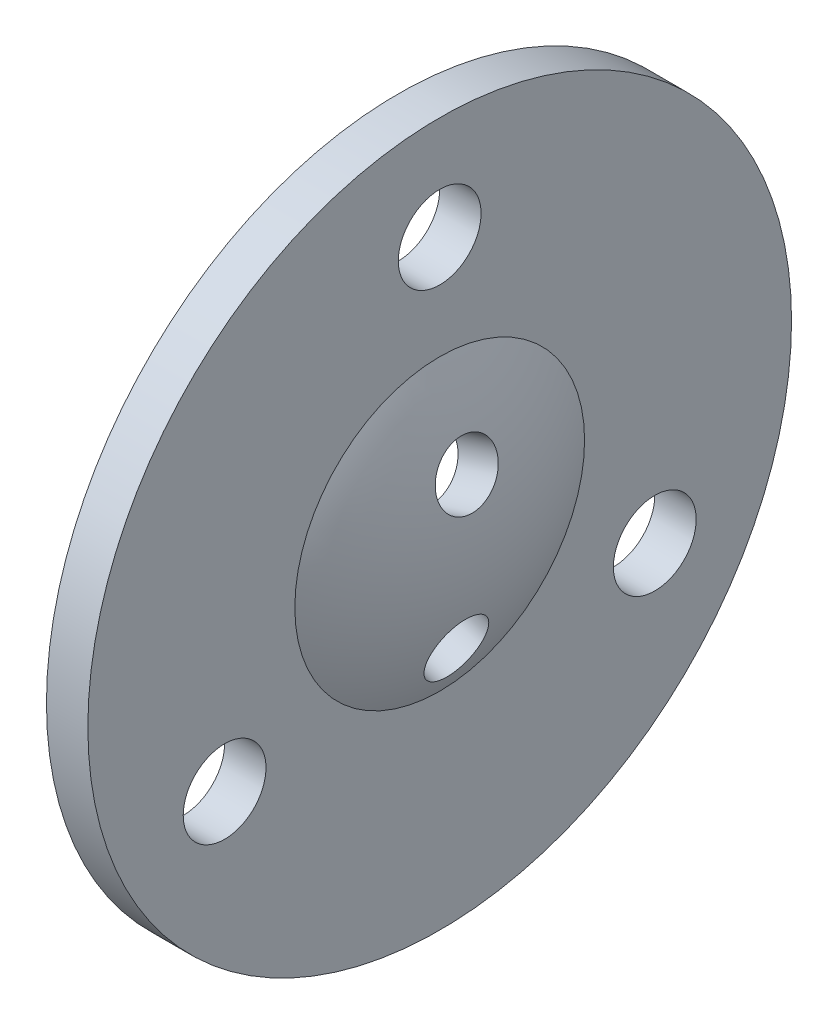
ISO-10303-21;
HEADER;
FILE_DESCRIPTION(('STEP AP214'),'2;1');
FILE_NAME('part.step','',(''),(''),'','','');
FILE_SCHEMA(('AUTOMOTIVE_DESIGN { 1 0 10303 214 1 1 1 1 }'));
ENDSEC;
DATA;
#1=APPLICATION_CONTEXT('core data for automotive mechanical design processes');
#2=APPLICATION_PROTOCOL_DEFINITION('international standard','automotive_design',2000,#1);
#3=PRODUCT_CONTEXT('',#1,'mechanical');
#4=PRODUCT('Part','Part','',(#3));
#5=PRODUCT_RELATED_PRODUCT_CATEGORY('part','',(#4));
#6=PRODUCT_DEFINITION_FORMATION('','',#4);
#7=PRODUCT_DEFINITION_CONTEXT('part definition',#1,'design');
#8=PRODUCT_DEFINITION('design','',#6,#7);
#9=PRODUCT_DEFINITION_SHAPE('','',#8);
#10=(LENGTH_UNIT() NAMED_UNIT(*) SI_UNIT(.MILLI.,.METRE.));
#11=(NAMED_UNIT(*) PLANE_ANGLE_UNIT() SI_UNIT($,.RADIAN.));
#12=(NAMED_UNIT(*) SI_UNIT($,.STERADIAN.) SOLID_ANGLE_UNIT());
#13=UNCERTAINTY_MEASURE_WITH_UNIT(LENGTH_MEASURE(1.E-05),#10,'distance_accuracy_value','');
#14=(GEOMETRIC_REPRESENTATION_CONTEXT(3) GLOBAL_UNCERTAINTY_ASSIGNED_CONTEXT((#13)) GLOBAL_UNIT_ASSIGNED_CONTEXT((#10,
#11,#12)) REPRESENTATION_CONTEXT('',''));
#15=CARTESIAN_POINT('',(0.,0.,0.));
#16=DIRECTION('',(0.,0.,1.));
#17=DIRECTION('',(1.,0.,0.));
#18=AXIS2_PLACEMENT_3D('',#15,#16,#17);
#19=CARTESIAN_POINT('',(0.,0.,0.));
#20=DIRECTION('',(-1.,0.,0.));
#21=DIRECTION('',(0.,1.,0.));
#22=AXIS2_PLACEMENT_3D('',#19,#20,#21);
#23=SPHERICAL_SURFACE('',#22,16.);
#24=CARTESIAN_POINT('',(15.1922649930537,-4.79010275263843,0.));
#25=DIRECTION('',(-0.953716950748227,0.300705799504274,0.));
#26=DIRECTION('',(-0.300705799504274,-0.953716950748227,0.));
#27=AXIS2_PLACEMENT_3D('',#24,#25,#26);
#28=CIRCLE('',#27,1.5);
#29=CARTESIAN_POINT('',(14.7412062937973,-6.22067817876077,0.));
#30=VERTEX_POINT('',#29);
#31=EDGE_CURVE('E60',#30,#30,#28,.T.);
#32=ORIENTED_EDGE('',*,*,#31,.T.);
#33=EDGE_LOOP('',(#32));
#34=FACE_BOUND('',#33,.T.);
#35=CARTESIAN_POINT('',(15.9214315608037,1.41312496248095,-0.714909011733329));
#36=CARTESIAN_POINT('',(15.9282394674415,1.37355134846859,-0.641508794516006));
#37=CARTESIAN_POINT('',(15.9340028574223,1.34003315946315,-0.564680552146841));
#38=CARTESIAN_POINT('',(15.9432660539467,1.28614947605179,-0.406345507594198));
#39=CARTESIAN_POINT('',(15.946763334226,1.26579866070172,-0.324833593828127));
#40=CARTESIAN_POINT('',(15.9513852532108,1.23890165254398,-0.159514459844571));
#41=CARTESIAN_POINT('',(15.952510608447,1.23235129078241,-0.0757079405522018));
#42=CARTESIAN_POINT('',(15.9523569151515,1.23324582428864,0.0918067045976922));
#43=CARTESIAN_POINT('',(15.9510784317157,1.24068743031695,0.175514848952478));
#44=CARTESIAN_POINT('',(15.9461606645701,1.26930557187547,0.340307980049379));
#45=CARTESIAN_POINT('',(15.9425259943062,1.29045526676845,0.421397768525313));
#46=CARTESIAN_POINT('',(15.9330053210524,1.34583472699573,0.578841427233263));
#47=CARTESIAN_POINT('',(15.9271192231664,1.38006504366901,0.655195097683552));
#48=CARTESIAN_POINT('',(15.9132446544674,1.46071235838254,0.801243005191184));
#49=CARTESIAN_POINT('',(15.9052502608605,1.50716368778359,0.870917715232028));
#50=CARTESIAN_POINT('',(15.8873942773776,1.6108530670673,1.0014403677339));
#51=CARTESIAN_POINT('',(15.8775326249463,1.66809147832955,1.06228801435731));
#52=CARTESIAN_POINT('',(15.8561382312471,1.79218111850615,1.17392484133709));
#53=CARTESIAN_POINT('',(15.8445935066339,1.85910125203666,1.22463512524324));
#54=CARTESIAN_POINT('',(15.8202126525132,2.0003179301913,1.31405242726557));
#55=CARTESIAN_POINT('',(15.8073764637763,2.07461481312704,1.35275889452814));
#56=CARTESIAN_POINT('',(15.7806510085735,2.22917657850958,1.41742171420749));
#57=CARTESIAN_POINT('',(15.7667534761029,2.30948818610949,1.44326298255995));
#58=CARTESIAN_POINT('',(15.7383945297169,2.47322969518423,1.48099056466402));
#59=CARTESIAN_POINT('',(15.7239330928618,2.55665972351124,1.49287631008924));
#60=CARTESIAN_POINT('',(15.6947590649336,2.72482443898191,1.50240471353614));
#61=CARTESIAN_POINT('',(15.6800454708639,2.80956401447904,1.49995825760005));
#62=CARTESIAN_POINT('',(15.6508727861239,2.97743634840585,1.48067724233807));
#63=CARTESIAN_POINT('',(15.6364136990489,3.06056908413914,1.46384247993102));
#64=CARTESIAN_POINT('',(15.6081497886699,3.22294394058286,1.41621247382764));
#65=CARTESIAN_POINT('',(15.5943456144052,3.30218220443282,1.38540368799683));
#66=CARTESIAN_POINT('',(15.5678080541037,3.45440162397824,1.31065894489047));
#67=CARTESIAN_POINT('',(15.5550746490555,3.52738289076639,1.26672322074524));
#68=CARTESIAN_POINT('',(15.5311113373314,3.66464047679794,1.16717095470493));
#69=CARTESIAN_POINT('',(15.519874718343,3.7289556749937,1.11160964695809));
#70=CARTESIAN_POINT('',(15.499172090143,3.84738860205327,0.990232997111271));
#71=CARTESIAN_POINT('',(15.4897060054105,3.90150676586572,0.924418092591439));
#72=CARTESIAN_POINT('',(15.472902191411,3.99753542140749,0.784975557874616));
#73=CARTESIAN_POINT('',(15.4655477143373,4.03954198581587,0.711416110160352));
#74=CARTESIAN_POINT('',(15.4530896003373,4.11067880397958,0.55813802174442));
#75=CARTESIAN_POINT('',(15.4479858555917,4.13980967453282,0.47841967629388));
#76=CARTESIAN_POINT('',(15.4402188398955,4.18413518774624,0.315779970695861));
#77=CARTESIAN_POINT('',(15.4375361803432,4.19944054914605,0.232889700723616));
#78=CARTESIAN_POINT('',(15.4346235466551,4.21605776900795,0.0656766410495282));
#79=CARTESIAN_POINT('',(15.4343934934669,4.21737007849394,-0.0186461023930988));
#80=CARTESIAN_POINT('',(15.4363884745262,4.20598855384075,-0.185927053628296));
#81=CARTESIAN_POINT('',(15.4386024353553,4.19335789296813,-0.268889701735019));
#82=CARTESIAN_POINT('',(15.4453999633499,4.15456809902756,-0.431486968879458));
#83=CARTESIAN_POINT('',(15.4499835233678,4.12840900676626,-0.511121597954902));
#84=CARTESIAN_POINT('',(15.4613865968583,4.06330524506965,-0.664894946527899));
#85=CARTESIAN_POINT('',(15.4682082027248,4.02434861091145,-0.739028443071157));
#86=CARTESIAN_POINT('',(15.4838816974956,3.93479663916341,-0.87965549999377));
#87=CARTESIAN_POINT('',(15.4927336360224,3.8842010171098,-0.946148873584427));
#88=CARTESIAN_POINT('',(15.5122651743086,3.77249673030015,-1.07004273962463));
#89=CARTESIAN_POINT('',(15.5229553398258,3.71132727794411,-1.12738674926237));
#90=CARTESIAN_POINT('',(15.5458140201554,3.58043926699733,-1.23094128570615));
#91=CARTESIAN_POINT('',(15.5579826020616,3.5107203204097,-1.2771513069423));
#92=CARTESIAN_POINT('',(15.5835574691787,3.36408010356739,-1.35754063366048));
#93=CARTESIAN_POINT('',(15.5969733606532,3.2871028552543,-1.3916147747377));
#94=CARTESIAN_POINT('',(15.6245704387393,3.12862824542189,-1.44627127556417));
#95=CARTESIAN_POINT('',(15.6387516604006,3.04713067688111,-1.46685301683473));
#96=CARTESIAN_POINT('',(15.6675868403491,2.88127896915819,-1.49408081170484));
#97=CARTESIAN_POINT('',(15.6822435293583,2.79690809742297,-1.50062212375251));
#98=CARTESIAN_POINT('',(15.7115129607802,2.62827512768309,-1.49928461249674));
#99=CARTESIAN_POINT('',(15.7261257037481,2.54401302831184,-1.49140597216232));
#100=CARTESIAN_POINT('',(15.7549401070526,2.37772015292574,-1.46139574430588));
#101=CARTESIAN_POINT('',(15.769140385628,2.29569692252324,-1.43922098518504));
#102=CARTESIAN_POINT('',(15.7966843409988,2.13647159849106,-1.38116755718928));
#103=CARTESIAN_POINT('',(15.810027809793,2.05927067565969,-1.34528557529624));
#104=CARTESIAN_POINT('',(15.8354447112687,1.91210963140862,-1.26090079470531));
#105=CARTESIAN_POINT('',(15.8475208279776,1.84213421292943,-1.21242545604378));
#106=CARTESIAN_POINT('',(15.8700788818365,1.71133753364874,-1.10419002773948));
#107=CARTESIAN_POINT('',(15.8805627766805,1.65050503227469,-1.04444400192802));
#108=CARTESIAN_POINT('',(15.8961138984722,1.56022263708914,-0.939248372495269));
#109=CARTESIAN_POINT('',(15.9017520805606,1.52747730882856,-0.896662289241859));
#110=CARTESIAN_POINT('',(15.9122155206048,1.46669003909626,-0.808162445182826));
#111=CARTESIAN_POINT('',(15.9170407815108,1.4386480805544,-0.762248696455313));
#112=CARTESIAN_POINT('',(15.9214315608037,1.41312496248095,-0.714909011733329));
#113=B_SPLINE_CURVE_WITH_KNOTS('',3,(#35,#36,#37,#38,#39,#40,#41,#42,#43,#44,#45,#46,#47,#48,
#49,#50,#51,#52,#53,#54,#55,#56,#57,#58,#59,#60,#61,#62,#63,#64,#65,#66,#67,#68,#69,#70,#71,#72,
#73,#74,#75,#76,#77,#78,#79,#80,#81,#82,#83,#84,#85,#86,#87,#88,#89,#90,#91,#92,#93,#94,#95,#96,
#97,#98,#99,#100,#101,#102,#103,#104,#105,#106,#107,#108,#109,#110,#111,#112),.UNSPECIFIED.,.T.,
.F.,(4,2,2,2,2,2,2,2,2,2,2,2,2,2,2,2,2,2,2,2,2,2,2,2,2,2,2,2,2,2,2,2,2,2,2,2,2,2,4),(0.,
0.250802516617027,0.50188414961433,0.752889922936274,1.00383669706018,1.25429359208518,
1.50476104485625,1.75593976825355,2.00712690792188,2.26019875870744,2.51328222121017,
2.76859066298819,3.02390950161727,3.28081752541618,3.53772917535703,3.79489033040511,
4.05204691862285,4.3080084020411,4.56395896509621,4.81781958004914,5.07166803273163,
5.32346509077693,5.57525403287745,5.82590682657553,6.07655886421841,6.32744591246443,
6.57833909319005,6.83072575178381,7.08312386854106,7.33765879459324,7.59220538746693,
7.8486443907601,8.10508014022386,8.362293928048,8.61956992348834,8.8762895652007,
9.13269095999372,9.29444736353342,9.45620317999071),.UNSPECIFIED.);
#114=CARTESIAN_POINT('',(15.9214315608037,1.41312496248095,-0.714909011733329));
#115=VERTEX_POINT('',#114);
#116=EDGE_CURVE('E59',#115,#115,#113,.T.);
#117=ORIENTED_EDGE('',*,*,#116,.T.);
#118=EDGE_LOOP('',(#117));
#119=FACE_BOUND('',#118,.T.);
#120=CARTESIAN_POINT('',(14.3874945699382,0.,0.));
#121=DIRECTION('',(-1.,0.,0.));
#122=DIRECTION('',(0.,0.,1.));
#123=AXIS2_PLACEMENT_3D('',#120,#121,#122);
#124=CIRCLE('',#123,7.);
#125=CARTESIAN_POINT('',(14.3874945699382,0.,7.));
#126=VERTEX_POINT('',#125);
#127=EDGE_CURVE('E10',#126,#126,#124,.T.);
#128=ORIENTED_EDGE('',*,*,#127,.F.);
#129=EDGE_LOOP('',(#128));
#130=FACE_BOUND('',#129,.T.);
#131=ADVANCED_FACE('F36',(#34,#119,#130),#23,.T.);
#132=CARTESIAN_POINT('',(14.3874945699382,7.,0.));
#133=DIRECTION('',(-1.,0.,0.));
#134=DIRECTION('',(0.,0.,1.));
#135=AXIS2_PLACEMENT_3D('',#132,#133,#134);
#136=PLANE('',#135);
#137=CARTESIAN_POINT('',(14.3874945699382,-5.99999999999991,-10.3923048454133));
#138=DIRECTION('',(-1.,0.,0.));
#139=DIRECTION('',(0.,0.,1.));
#140=AXIS2_PLACEMENT_3D('',#137,#138,#139);
#141=CIRCLE('',#140,2.);
#142=CARTESIAN_POINT('',(14.3874945699382,-5.99999999999991,-8.39230484541332));
#143=VERTEX_POINT('',#142);
#144=EDGE_CURVE('E97',#143,#143,#141,.T.);
#145=ORIENTED_EDGE('',*,*,#144,.T.);
#146=EDGE_LOOP('',(#145));
#147=FACE_BOUND('',#146,.T.);
#148=CARTESIAN_POINT('',(14.3874945699382,12.,0.));
#149=DIRECTION('',(-1.,0.,0.));
#150=DIRECTION('',(0.,0.,1.));
#151=AXIS2_PLACEMENT_3D('',#148,#149,#150);
#152=CIRCLE('',#151,2.);
#153=CARTESIAN_POINT('',(14.3874945699382,12.,2.));
#154=VERTEX_POINT('',#153);
#155=EDGE_CURVE('E94',#154,#154,#152,.T.);
#156=ORIENTED_EDGE('',*,*,#155,.T.);
#157=EDGE_LOOP('',(#156));
#158=FACE_BOUND('',#157,.T.);
#159=CARTESIAN_POINT('',(14.3874945699382,-6.00000000000005,10.3923048454132));
#160=DIRECTION('',(-1.,0.,0.));
#161=DIRECTION('',(0.,0.,1.));
#162=AXIS2_PLACEMENT_3D('',#159,#160,#161);
#163=CIRCLE('',#162,2.);
#164=CARTESIAN_POINT('',(14.3874945699382,-6.00000000000005,12.3923048454132));
#165=VERTEX_POINT('',#164);
#166=EDGE_CURVE('E86',#165,#165,#163,.T.);
#167=ORIENTED_EDGE('',*,*,#166,.T.);
#168=EDGE_LOOP('',(#167));
#169=FACE_BOUND('',#168,.T.);
#170=CARTESIAN_POINT('',(14.3874945699382,0.,0.));
#171=DIRECTION('',(-1.,0.,0.));
#172=DIRECTION('',(0.,0.,1.));
#173=AXIS2_PLACEMENT_3D('',#170,#171,#172);
#174=CIRCLE('',#173,17.);
#175=CARTESIAN_POINT('',(14.3874945699382,0.,17.));
#176=VERTEX_POINT('',#175);
#177=EDGE_CURVE('E44',#176,#176,#174,.T.);
#178=ORIENTED_EDGE('',*,*,#177,.F.);
#179=EDGE_LOOP('',(#178));
#180=FACE_BOUND('',#179,.T.);
#181=ORIENTED_EDGE('',*,*,#127,.T.);
#182=EDGE_LOOP('',(#181));
#183=FACE_BOUND('',#182,.T.);
#184=ADVANCED_FACE('F110',(#147,#158,#169,#180,#183),#136,.F.);
#185=CARTESIAN_POINT('',(0.,0.,0.));
#186=DIRECTION('',(-1.,0.,0.));
#187=DIRECTION('',(0.,0.,1.));
#188=AXIS2_PLACEMENT_3D('',#185,#186,#187);
#189=CYLINDRICAL_SURFACE('',#188,17.);
#190=CARTESIAN_POINT('',(12.3874945699382,0.,0.));
#191=DIRECTION('',(-1.,0.,0.));
#192=DIRECTION('',(0.,0.,1.));
#193=AXIS2_PLACEMENT_3D('',#190,#191,#192);
#194=CIRCLE('',#193,17.);
#195=CARTESIAN_POINT('',(12.3874945699382,0.,17.));
#196=VERTEX_POINT('',#195);
#197=EDGE_CURVE('E49',#196,#196,#194,.T.);
#198=ORIENTED_EDGE('',*,*,#197,.F.);
#199=EDGE_LOOP('',(#198));
#200=FACE_BOUND('',#199,.T.);
#201=ORIENTED_EDGE('',*,*,#177,.T.);
#202=EDGE_LOOP('',(#201));
#203=FACE_BOUND('',#202,.T.);
#204=ADVANCED_FACE('F107',(#200,#203),#189,.T.);
#205=CARTESIAN_POINT('',(12.3874945699382,17.,0.));
#206=DIRECTION('',(1.,0.,0.));
#207=DIRECTION('',(0.,0.,-1.));
#208=AXIS2_PLACEMENT_3D('',#205,#206,#207);
#209=PLANE('',#208);
#210=CARTESIAN_POINT('',(12.3874945699382,-5.99999999999991,-10.3923048454133));
#211=DIRECTION('',(-1.,0.,0.));
#212=DIRECTION('',(0.,0.,1.));
#213=AXIS2_PLACEMENT_3D('',#210,#211,#212);
#214=CIRCLE('',#213,2.);
#215=CARTESIAN_POINT('',(12.3874945699382,-5.99999999999991,-8.39230484541332));
#216=VERTEX_POINT('',#215);
#217=EDGE_CURVE('E83',#216,#216,#214,.T.);
#218=ORIENTED_EDGE('',*,*,#217,.F.);
#219=EDGE_LOOP('',(#218));
#220=FACE_BOUND('',#219,.T.);
#221=CARTESIAN_POINT('',(12.3874945699382,12.,0.));
#222=DIRECTION('',(-1.,0.,0.));
#223=DIRECTION('',(0.,0.,1.));
#224=AXIS2_PLACEMENT_3D('',#221,#222,#223);
#225=CIRCLE('',#224,2.);
#226=CARTESIAN_POINT('',(12.3874945699382,12.,2.));
#227=VERTEX_POINT('',#226);
#228=EDGE_CURVE('E87',#227,#227,#225,.T.);
#229=ORIENTED_EDGE('',*,*,#228,.F.);
#230=EDGE_LOOP('',(#229));
#231=FACE_BOUND('',#230,.T.);
#232=CARTESIAN_POINT('',(12.3874945699382,-6.00000000000005,10.3923048454132));
#233=DIRECTION('',(-1.,0.,0.));
#234=DIRECTION('',(0.,0.,1.));
#235=AXIS2_PLACEMENT_3D('',#232,#233,#234);
#236=CIRCLE('',#235,2.);
#237=CARTESIAN_POINT('',(12.3874945699382,-6.00000000000005,12.3923048454132));
#238=VERTEX_POINT('',#237);
#239=EDGE_CURVE('E82',#238,#238,#236,.T.);
#240=ORIENTED_EDGE('',*,*,#239,.F.);
#241=EDGE_LOOP('',(#240));
#242=FACE_BOUND('',#241,.T.);
#243=CARTESIAN_POINT('',(12.3874945699382,0.,0.));
#244=DIRECTION('',(-1.,0.,0.));
#245=DIRECTION('',(0.,0.,1.));
#246=AXIS2_PLACEMENT_3D('',#243,#244,#245);
#247=CIRCLE('',#246,6.52303443803209);
#248=CARTESIAN_POINT('',(12.3874945699382,0.,6.52303443803209));
#249=VERTEX_POINT('',#248);
#250=EDGE_CURVE('E100',#249,#249,#247,.T.);
#251=ORIENTED_EDGE('',*,*,#250,.F.);
#252=EDGE_LOOP('',(#251));
#253=FACE_BOUND('',#252,.T.);
#254=ORIENTED_EDGE('',*,*,#197,.T.);
#255=EDGE_LOOP('',(#254));
#256=FACE_BOUND('',#255,.T.);
#257=ADVANCED_FACE('F105',(#220,#231,#242,#253,#256),#209,.F.);
#258=CARTESIAN_POINT('',(0.,0.,0.));
#259=DIRECTION('',(-1.,0.,0.));
#260=DIRECTION('',(0.,1.,0.));
#261=AXIS2_PLACEMENT_3D('',#258,#259,#260);
#262=SPHERICAL_SURFACE('',#261,14.);
#263=CARTESIAN_POINT('',(13.2751781265072,-4.18564758544051,0.));
#264=DIRECTION('',(-0.953716950748227,0.300705799504274,0.));
#265=DIRECTION('',(-0.300705799504274,-0.953716950748227,0.));
#266=AXIS2_PLACEMENT_3D('',#263,#264,#265);
#267=CIRCLE('',#266,1.5);
#268=CARTESIAN_POINT('',(12.8241194272508,-5.61622301156285,0.));
#269=VERTEX_POINT('',#268);
#270=EDGE_CURVE('E40',#269,#269,#267,.F.);
#271=ORIENTED_EDGE('',*,*,#270,.T.);
#272=EDGE_LOOP('',(#271));
#273=FACE_BOUND('',#272,.T.);
#274=CARTESIAN_POINT('',(13.9752800632086,0.687728000014335,-0.467522569380167));
#275=CARTESIAN_POINT('',(13.9713160739008,0.71396052319419,-0.547414410773568));
#276=CARTESIAN_POINT('',(13.9663313174325,0.746936309618841,-0.625109483100861));
#277=CARTESIAN_POINT('',(13.9544630080059,0.825384665590895,-0.773836942315905));
#278=CARTESIAN_POINT('',(13.9475770001968,0.870873391265452,-0.844860555191871));
#279=CARTESIAN_POINT('',(13.9321125827601,0.972926860788224,-0.978134069343655));
#280=CARTESIAN_POINT('',(13.9235357770082,1.02948110760599,-1.04039219027862));
#281=CARTESIAN_POINT('',(13.9049296359328,1.1520230443109,-1.15450015243542));
#282=CARTESIAN_POINT('',(13.8949006440937,1.2180085033938,-1.20635244803784));
#283=CARTESIAN_POINT('',(13.8735755040518,1.35813432830248,-1.29868667539937));
#284=CARTESIAN_POINT('',(13.8622693958138,1.4323386905609,-1.33906917473779));
#285=CARTESIAN_POINT('',(13.8387717994001,1.58634313119686,-1.40681443061238));
#286=CARTESIAN_POINT('',(13.8265802236206,1.66614376321436,-1.4341758968847));
#287=CARTESIAN_POINT('',(13.8015133291024,1.82998434456445,-1.47538346816039));
#288=CARTESIAN_POINT('',(13.7886321126408,1.91406038341044,-1.4890825757269));
#289=CARTESIAN_POINT('',(13.7626669408219,2.08328874787161,-1.50209117329169));
#290=CARTESIAN_POINT('',(13.7495829777079,2.16844111464244,-1.50140011137812));
#291=CARTESIAN_POINT('',(13.7235101461894,2.3378861466329,-1.4855998930017));
#292=CARTESIAN_POINT('',(13.7105221616974,2.4221717702039,-1.47041357905952));
#293=CARTESIAN_POINT('',(13.6850866136124,2.58701328142439,-1.42590908230674));
#294=CARTESIAN_POINT('',(13.6726390488291,2.66756917728913,-1.39659093062512));
#295=CARTESIAN_POINT('',(13.6486759445619,2.82245775705661,-1.32468658702556));
#296=CARTESIAN_POINT('',(13.6371584157936,2.89680373594594,-1.28212971256774));
#297=CARTESIAN_POINT('',(13.6153701306466,3.03729497667384,-1.18488473925353));
#298=CARTESIAN_POINT('',(13.6050993249931,3.10344056262193,-1.130197120087));
#299=CARTESIAN_POINT('',(13.5862027324027,3.22502662597222,-1.01073632494684));
#300=CARTESIAN_POINT('',(13.5775634494892,3.28055498177711,-0.946054744507181));
#301=CARTESIAN_POINT('',(13.5620890205163,3.37994518039606,-0.808083622276029));
#302=CARTESIAN_POINT('',(13.5552537599755,3.42380776351062,-0.734794627129814));
#303=CARTESIAN_POINT('',(13.543670272071,3.49810331250168,-0.582575582149746));
#304=CARTESIAN_POINT('',(13.5388994177876,3.52868189313839,-0.503718318408586));
#305=CARTESIAN_POINT('',(13.5314851708546,3.5761902917099,-0.341899487301559));
#306=CARTESIAN_POINT('',(13.5288416582709,3.59312087908341,-0.258938151592626));
#307=CARTESIAN_POINT('',(13.5257805256863,3.61272527006725,-0.0920608714319513));
#308=CARTESIAN_POINT('',(13.525343248425,3.61552497799869,-0.00816005714503196));
#309=CARTESIAN_POINT('',(13.5266552170854,3.6071234862382,0.158918794294573));
#310=CARTESIAN_POINT('',(13.5284044058012,3.59592265285139,0.242096850299913));
#311=CARTESIAN_POINT('',(13.5340257742973,3.5599122067934,0.405128197974622));
#312=CARTESIAN_POINT('',(13.5378919322311,3.53514119521702,0.484990232258205));
#313=CARTESIAN_POINT('',(13.5476224746559,3.47275861413296,0.639398307298697));
#314=CARTESIAN_POINT('',(13.5534868855859,3.4351468747277,0.713944277702202));
#315=CARTESIAN_POINT('',(13.5670638299339,3.34800107073675,0.855970678168188));
#316=CARTESIAN_POINT('',(13.5747843333502,3.29841558711256,0.923418783762728));
#317=CARTESIAN_POINT('',(13.5918262128001,3.18885640585213,1.04903489965791));
#318=CARTESIAN_POINT('',(13.6011476615971,3.12888223604649,1.10720248792485));
#319=CARTESIAN_POINT('',(13.6212139168098,2.99963113168134,1.21321873445565));
#320=CARTESIAN_POINT('',(13.6319716797253,2.93026942649726,1.26096157741802));
#321=CARTESIAN_POINT('',(13.6545245644542,2.78467476198134,1.34413643382165));
#322=CARTESIAN_POINT('',(13.6663197486459,2.70844138946167,1.37956770635539));
#323=CARTESIAN_POINT('',(13.6907455534757,2.55036227453846,1.43751641344352));
#324=CARTESIAN_POINT('',(13.7033839676736,2.46846380864157,1.45988677120782));
#325=CARTESIAN_POINT('',(13.7290169679897,2.30212280557268,1.49051697574077));
#326=CARTESIAN_POINT('',(13.7420115715013,2.21768014414243,1.49877613217927));
#327=CARTESIAN_POINT('',(13.7680929405475,2.0479518676923,1.50097947509874));
#328=CARTESIAN_POINT('',(13.7811796425596,1.96266478007981,1.49481258383737));
#329=CARTESIAN_POINT('',(13.8069752168132,1.79431265151312,1.46809680445904));
#330=CARTESIAN_POINT('',(13.8196840815435,1.71124765473638,1.44754763062778));
#331=CARTESIAN_POINT('',(13.8443773844847,1.54963213148435,1.39258726575822));
#332=CARTESIAN_POINT('',(13.8563611395026,1.47108586584965,1.35816322882608));
#333=CARTESIAN_POINT('',(13.879250878383,1.32086837043845,1.27637990895425));
#334=CARTESIAN_POINT('',(13.8901568882365,1.2491969748676,1.22902093805938));
#335=CARTESIAN_POINT('',(13.9105111036825,1.1152856011967,1.12301682992446));
#336=CARTESIAN_POINT('',(13.9199683436715,1.05298722139404,1.06444722959567));
#337=CARTESIAN_POINT('',(13.9372362010969,0.939132336588574,0.937455524260203));
#338=CARTESIAN_POINT('',(13.9450469828802,0.887574759461788,0.869034403765342));
#339=CARTESIAN_POINT('',(13.9587148997626,0.797291397118265,0.725111058514701));
#340=CARTESIAN_POINT('',(13.9645932277871,0.758426447142461,0.649698141177513));
#341=CARTESIAN_POINT('',(13.9743460425894,0.69391510246154,0.493270130923084));
#342=CARTESIAN_POINT('',(13.9782201516828,0.668271199195199,0.412253985366033));
#343=CARTESIAN_POINT('',(13.9838187225041,0.631204690473457,0.247855930687645));
#344=CARTESIAN_POINT('',(13.9855651043249,0.619637071059128,0.164507354513265));
#345=CARTESIAN_POINT('',(13.9869280835228,0.61060950302867,-0.00289567887710562));
#346=CARTESIAN_POINT('',(13.9865473951139,0.61313157548595,-0.0869490999194045));
#347=CARTESIAN_POINT('',(13.9842417148523,0.628401585077722,-0.220658292458972));
#348=CARTESIAN_POINT('',(13.9829813185319,0.63674859413191,-0.270869458686953));
#349=CARTESIAN_POINT('',(13.9796982224018,0.658485576404372,-0.37016201118081));
#350=CARTESIAN_POINT('',(13.977675527958,0.67187551412571,-0.419243405396517));
#351=CARTESIAN_POINT('',(13.9752800632086,0.687728000014335,-0.467522569380167));
#352=B_SPLINE_CURVE_WITH_KNOTS('',3,(#274,#275,#276,#277,#278,#279,#280,#281,#282,#283,#284,
#285,#286,#287,#288,#289,#290,#291,#292,#293,#294,#295,#296,#297,#298,#299,#300,#301,#302,#303,
#304,#305,#306,#307,#308,#309,#310,#311,#312,#313,#314,#315,#316,#317,#318,#319,#320,#321,#322,
#323,#324,#325,#326,#327,#328,#329,#330,#331,#332,#333,#334,#335,#336,#337,#338,#339,#340,#341,
#342,#343,#344,#345,#346,#347,#348,#349,#350,#351),.UNSPECIFIED.,.T.,.F.,(4,2,2,2,2,2,2,2,2,2,2,
2,2,2,2,2,2,2,2,2,2,2,2,2,2,2,2,2,2,2,2,2,2,2,2,2,2,2,4),(0.,0.252357044168434,
0.505041461944591,0.757487329044372,1.00987358257831,1.26438529562103,1.51892222317011,
1.77616916436033,2.03342597186245,2.2920598254506,2.55069310933424,2.8087576727435,
3.06681203324287,3.32262805800142,3.57842784500636,3.83134817958882,4.08425425417644,
4.33490294010572,4.58554506829022,4.8354779059606,5.08541405065739,5.33644320846937,
5.58748377863929,5.84096489554422,6.09446126424461,6.35075974192953,6.60707075756203,
6.86536180647635,7.12365798667196,7.38219385896782,7.64072349484563,7.89756886715138,
8.1543885894034,8.40828975843733,8.66223875637829,8.91354879775562,9.16453823227002,
9.31704032339768,9.46954134109037),.UNSPECIFIED.);
#353=CARTESIAN_POINT('',(13.9752800632086,0.687728000014335,-0.467522569380167));
#354=VERTEX_POINT('',#353);
#355=EDGE_CURVE('E52',#354,#354,#352,.T.);
#356=ORIENTED_EDGE('',*,*,#355,.T.);
#357=EDGE_LOOP('',(#356));
#358=FACE_BOUND('',#357,.T.);
#359=ORIENTED_EDGE('',*,*,#250,.T.);
#360=EDGE_LOOP('',(#359));
#361=FACE_BOUND('',#360,.T.);
#362=ADVANCED_FACE('F61',(#273,#358,#361),#262,.F.);
#363=CARTESIAN_POINT('',(22.3874945699382,-6.00000000000005,10.3923048454132));
#364=DIRECTION('',(-1.,0.,0.));
#365=DIRECTION('',(0.,0.,1.));
#366=AXIS2_PLACEMENT_3D('',#363,#364,#365);
#367=CYLINDRICAL_SURFACE('',#366,2.);
#368=ORIENTED_EDGE('',*,*,#239,.T.);
#369=EDGE_LOOP('',(#368));
#370=FACE_BOUND('',#369,.T.);
#371=ORIENTED_EDGE('',*,*,#166,.F.);
#372=EDGE_LOOP('',(#371));
#373=FACE_BOUND('',#372,.T.);
#374=ADVANCED_FACE('F127',(#370,#373),#367,.F.);
#375=CARTESIAN_POINT('',(22.3874945699382,12.,0.));
#376=DIRECTION('',(-1.,0.,0.));
#377=DIRECTION('',(0.,0.,1.));
#378=AXIS2_PLACEMENT_3D('',#375,#376,#377);
#379=CYLINDRICAL_SURFACE('',#378,2.);
#380=ORIENTED_EDGE('',*,*,#228,.T.);
#381=EDGE_LOOP('',(#380));
#382=FACE_BOUND('',#381,.T.);
#383=ORIENTED_EDGE('',*,*,#155,.F.);
#384=EDGE_LOOP('',(#383));
#385=FACE_BOUND('',#384,.T.);
#386=ADVANCED_FACE('F139',(#382,#385),#379,.F.);
#387=CARTESIAN_POINT('',(22.3874945699382,-5.99999999999991,-10.3923048454133));
#388=DIRECTION('',(-1.,0.,0.));
#389=DIRECTION('',(0.,0.,1.));
#390=AXIS2_PLACEMENT_3D('',#387,#388,#389);
#391=CYLINDRICAL_SURFACE('',#390,2.);
#392=ORIENTED_EDGE('',*,*,#217,.T.);
#393=EDGE_LOOP('',(#392));
#394=FACE_BOUND('',#393,.T.);
#395=ORIENTED_EDGE('',*,*,#144,.F.);
#396=EDGE_LOOP('',(#395));
#397=FACE_BOUND('',#396,.T.);
#398=ADVANCED_FACE('F71',(#394,#397),#391,.F.);
#399=CARTESIAN_POINT('',(8.72268291720884,0.526037914253288,0.));
#400=DIRECTION('',(0.953716950748227,0.300705799504274,0.));
#401=DIRECTION('',(-0.300705799504274,0.953716950748227,0.));
#402=AXIS2_PLACEMENT_3D('',#399,#400,#401);
#403=CYLINDRICAL_SURFACE('',#402,1.5);
#404=ORIENTED_EDGE('',*,*,#355,.F.);
#405=EDGE_LOOP('',(#404));
#406=FACE_BOUND('',#405,.T.);
#407=ORIENTED_EDGE('',*,*,#116,.F.);
#408=EDGE_LOOP('',(#407));
#409=FACE_BOUND('',#408,.T.);
#410=ADVANCED_FACE('F65',(#406,#409),#403,.F.);
#411=CARTESIAN_POINT('',(11.0959815905184,-3.49854955691397,0.));
#412=DIRECTION('',(0.953716950748227,-0.300705799504274,0.));
#413=DIRECTION('',(0.300705799504274,0.953716950748227,0.));
#414=AXIS2_PLACEMENT_3D('',#411,#412,#413);
#415=CYLINDRICAL_SURFACE('',#414,1.5);
#416=ORIENTED_EDGE('',*,*,#270,.F.);
#417=EDGE_LOOP('',(#416));
#418=FACE_BOUND('',#417,.T.);
#419=ORIENTED_EDGE('',*,*,#31,.F.);
#420=EDGE_LOOP('',(#419));
#421=FACE_BOUND('',#420,.T.);
#422=ADVANCED_FACE('F70',(#418,#421),#415,.F.);
#423=CLOSED_SHELL('',(#131,#184,#204,#257,#362,#374,#386,#398,#410,#422));
#424=MANIFOLD_SOLID_BREP('B2',#423);
#425=ADVANCED_BREP_SHAPE_REPRESENTATION('',(#18,#424),#14);
#426=SHAPE_DEFINITION_REPRESENTATION(#9,#425);
ENDSEC;
END-ISO-10303-21;
